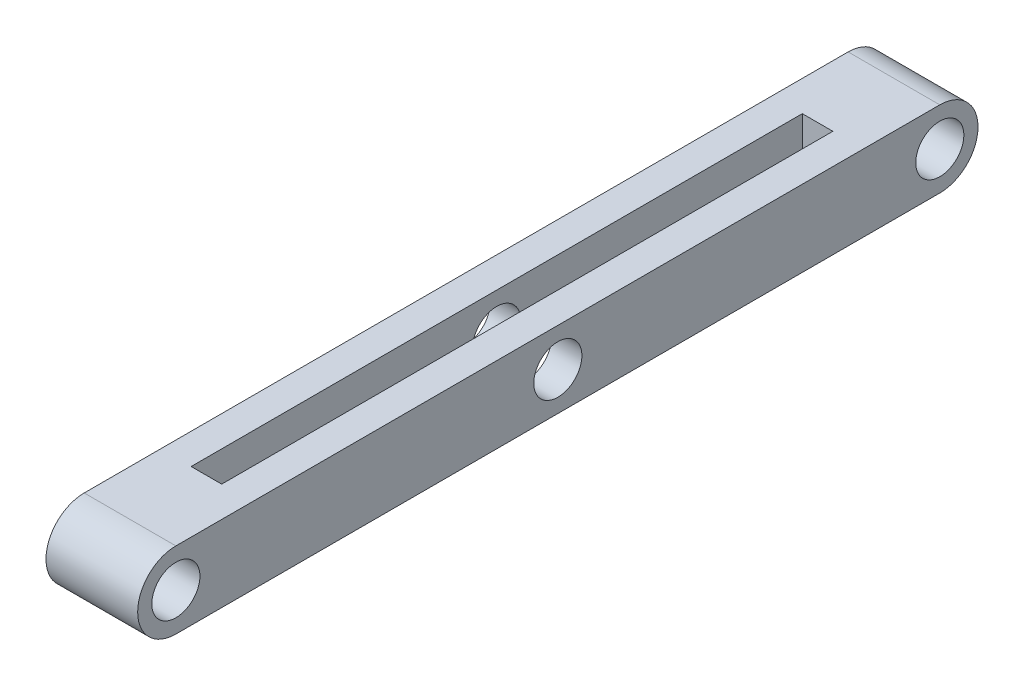
ISO-10303-21;
HEADER;
FILE_DESCRIPTION(('STEP AP214'),'2;1');
FILE_NAME('part.step','',(''),(''),'','','');
FILE_SCHEMA(('AUTOMOTIVE_DESIGN { 1 0 10303 214 1 1 1 1 }'));
ENDSEC;
DATA;
#1=APPLICATION_CONTEXT('core data for automotive mechanical design processes');
#2=APPLICATION_PROTOCOL_DEFINITION('international standard','automotive_design',2000,#1);
#3=PRODUCT_CONTEXT('',#1,'mechanical');
#4=PRODUCT('Part','Part','',(#3));
#5=PRODUCT_RELATED_PRODUCT_CATEGORY('part','',(#4));
#6=PRODUCT_DEFINITION_FORMATION('','',#4);
#7=PRODUCT_DEFINITION_CONTEXT('part definition',#1,'design');
#8=PRODUCT_DEFINITION('design','',#6,#7);
#9=PRODUCT_DEFINITION_SHAPE('','',#8);
#10=(LENGTH_UNIT() NAMED_UNIT(*) SI_UNIT(.MILLI.,.METRE.));
#11=(NAMED_UNIT(*) PLANE_ANGLE_UNIT() SI_UNIT($,.RADIAN.));
#12=(NAMED_UNIT(*) SI_UNIT($,.STERADIAN.) SOLID_ANGLE_UNIT());
#13=UNCERTAINTY_MEASURE_WITH_UNIT(LENGTH_MEASURE(1.E-05),#10,'distance_accuracy_value','');
#14=(GEOMETRIC_REPRESENTATION_CONTEXT(3) GLOBAL_UNCERTAINTY_ASSIGNED_CONTEXT((#13)) GLOBAL_UNIT_ASSIGNED_CONTEXT((#10,
#11,#12)) REPRESENTATION_CONTEXT('',''));
#15=CARTESIAN_POINT('',(0.,0.,0.));
#16=DIRECTION('',(0.,0.,1.));
#17=DIRECTION('',(1.,0.,0.));
#18=AXIS2_PLACEMENT_3D('',#15,#16,#17);
#19=CARTESIAN_POINT('',(15.24,2.06374999999999,13.97));
#20=DIRECTION('',(1.,0.,0.));
#21=DIRECTION('',(0.,0.,-1.));
#22=AXIS2_PLACEMENT_3D('',#19,#20,#21);
#23=CYLINDRICAL_SURFACE('',#22,3.99999999999998);
#24=CARTESIAN_POINT('',(5.08,2.06374999999999,13.97));
#25=DIRECTION('',(-1.,0.,0.));
#26=DIRECTION('',(0.,0.,1.));
#27=AXIS2_PLACEMENT_3D('',#24,#25,#26);
#28=CIRCLE('',#27,3.99999999999998);
#29=CARTESIAN_POINT('',(5.08,2.06374999999999,17.97));
#30=VERTEX_POINT('',#29);
#31=EDGE_CURVE('E38',#30,#30,#28,.F.);
#32=ORIENTED_EDGE('',*,*,#31,.T.);
#33=EDGE_LOOP('',(#32));
#34=FACE_BOUND('',#33,.T.);
#35=CARTESIAN_POINT('',(0.,2.06374999999999,13.97));
#36=DIRECTION('',(1.,0.,0.));
#37=DIRECTION('',(0.,0.,-1.));
#38=AXIS2_PLACEMENT_3D('',#35,#36,#37);
#39=CIRCLE('',#38,4.);
#40=CARTESIAN_POINT('',(0.,2.06374999999999,9.96999999999997));
#41=VERTEX_POINT('',#40);
#42=EDGE_CURVE('E154',#41,#41,#39,.T.);
#43=ORIENTED_EDGE('',*,*,#42,.F.);
#44=EDGE_LOOP('',(#43));
#45=FACE_BOUND('',#44,.T.);
#46=ADVANCED_FACE('F34',(#34,#45),#23,.F.);
#47=CARTESIAN_POINT('',(15.24,2.06374999999998,77.47));
#48=DIRECTION('',(-1.,0.,0.));
#49=DIRECTION('',(0.,0.,1.));
#50=AXIS2_PLACEMENT_3D('',#47,#48,#49);
#51=CYLINDRICAL_SURFACE('',#50,6.35);
#52=CARTESIAN_POINT('',(0.,2.06374999999998,77.47));
#53=DIRECTION('',(1.,0.,0.));
#54=DIRECTION('',(0.,0.,1.));
#55=AXIS2_PLACEMENT_3D('',#52,#53,#54);
#56=CIRCLE('',#55,6.35);
#57=CARTESIAN_POINT('',(0.,8.41374999999998,77.47));
#58=VERTEX_POINT('',#57);
#59=CARTESIAN_POINT('',(0.,-4.28625000000001,77.47));
#60=VERTEX_POINT('',#59);
#61=EDGE_CURVE('E157',#58,#60,#56,.T.);
#62=ORIENTED_EDGE('',*,*,#61,.T.);
#63=DIRECTION('',(-1.,0.,0.));
#64=VECTOR('',#63,1.);
#65=CARTESIAN_POINT('',(15.24,-4.28625000000001,77.47));
#66=LINE('',#65,#64);
#67=CARTESIAN_POINT('',(15.24,-4.28625000000001,77.47));
#68=VERTEX_POINT('',#67);
#69=EDGE_CURVE('E11',#68,#60,#66,.T.);
#70=ORIENTED_EDGE('',*,*,#69,.F.);
#71=CARTESIAN_POINT('',(15.24,2.06374999999998,77.47));
#72=DIRECTION('',(1.,0.,0.));
#73=DIRECTION('',(0.,0.,1.));
#74=AXIS2_PLACEMENT_3D('',#71,#72,#73);
#75=CIRCLE('',#74,6.35);
#76=CARTESIAN_POINT('',(15.24,8.41374999999998,77.47));
#77=VERTEX_POINT('',#76);
#78=EDGE_CURVE('E158',#77,#68,#75,.T.);
#79=ORIENTED_EDGE('',*,*,#78,.F.);
#80=DIRECTION('',(-1.,0.,0.));
#81=VECTOR('',#80,1.);
#82=CARTESIAN_POINT('',(15.24,8.41374999999998,77.47));
#83=LINE('',#82,#81);
#84=EDGE_CURVE('E168',#77,#58,#83,.T.);
#85=ORIENTED_EDGE('',*,*,#84,.T.);
#86=EDGE_LOOP('',(#62,#70,#79,#85));
#87=FACE_BOUND('',#86,.T.);
#88=ADVANCED_FACE('F36',(#87),#51,.T.);
#89=CARTESIAN_POINT('',(15.24,-4.28625,-49.53));
#90=DIRECTION('',(0.,1.,0.));
#91=DIRECTION('',(0.,0.,1.));
#92=AXIS2_PLACEMENT_3D('',#89,#90,#91);
#93=PLANE('',#92);
#94=DIRECTION('',(-1.,0.,0.));
#95=VECTOR('',#94,1.);
#96=CARTESIAN_POINT('',(5.07999999999998,-4.28625000000001,-36.83));
#97=LINE('',#96,#95);
#98=CARTESIAN_POINT('',(10.16,-4.28625000000001,-36.83));
#99=VERTEX_POINT('',#98);
#100=CARTESIAN_POINT('',(5.07999999999998,-4.28625000000001,-36.83));
#101=VERTEX_POINT('',#100);
#102=EDGE_CURVE('E110',#99,#101,#97,.T.);
#103=ORIENTED_EDGE('',*,*,#102,.T.);
#104=DIRECTION('',(0.,0.,1.));
#105=VECTOR('',#104,1.);
#106=CARTESIAN_POINT('',(5.08000000000001,-4.28625000000001,64.77));
#107=LINE('',#106,#105);
#108=CARTESIAN_POINT('',(5.08000000000001,-4.28625000000001,64.77));
#109=VERTEX_POINT('',#108);
#110=EDGE_CURVE('E104',#101,#109,#107,.T.);
#111=ORIENTED_EDGE('',*,*,#110,.T.);
#112=DIRECTION('',(1.,0.,0.));
#113=VECTOR('',#112,1.);
#114=CARTESIAN_POINT('',(5.08000000000001,-4.28625000000001,64.77));
#115=LINE('',#114,#113);
#116=CARTESIAN_POINT('',(10.16,-4.28625000000001,64.77));
#117=VERTEX_POINT('',#116);
#118=EDGE_CURVE('E113',#109,#117,#115,.T.);
#119=ORIENTED_EDGE('',*,*,#118,.T.);
#120=DIRECTION('',(0.,0.,-1.));
#121=VECTOR('',#120,1.);
#122=CARTESIAN_POINT('',(10.16,-4.28625000000001,64.77));
#123=LINE('',#122,#121);
#124=EDGE_CURVE('E51',#117,#99,#123,.T.);
#125=ORIENTED_EDGE('',*,*,#124,.T.);
#126=EDGE_LOOP('',(#103,#111,#119,#125));
#127=FACE_BOUND('',#126,.T.);
#128=DIRECTION('',(0.,0.,-1.));
#129=VECTOR('',#128,1.);
#130=CARTESIAN_POINT('',(0.,-4.28625,-49.53));
#131=LINE('',#130,#129);
#132=CARTESIAN_POINT('',(0.,-4.28625,-49.53));
#133=VERTEX_POINT('',#132);
#134=EDGE_CURVE('E171',#60,#133,#131,.T.);
#135=ORIENTED_EDGE('',*,*,#134,.T.);
#136=DIRECTION('',(-1.,0.,0.));
#137=VECTOR('',#136,1.);
#138=CARTESIAN_POINT('',(15.24,-4.28625,-49.53));
#139=LINE('',#138,#137);
#140=CARTESIAN_POINT('',(15.24,-4.28625,-49.53));
#141=VERTEX_POINT('',#140);
#142=EDGE_CURVE('E43',#141,#133,#139,.T.);
#143=ORIENTED_EDGE('',*,*,#142,.F.);
#144=DIRECTION('',(0.,0.,-1.));
#145=VECTOR('',#144,1.);
#146=CARTESIAN_POINT('',(15.24,-4.28625,-49.53));
#147=LINE('',#146,#145);
#148=EDGE_CURVE('E161',#68,#141,#147,.T.);
#149=ORIENTED_EDGE('',*,*,#148,.F.);
#150=ORIENTED_EDGE('',*,*,#69,.T.);
#151=EDGE_LOOP('',(#135,#143,#149,#150));
#152=FACE_BOUND('',#151,.T.);
#153=ADVANCED_FACE('F117',(#127,#152),#93,.F.);
#154=CARTESIAN_POINT('',(15.24,2.06374999999999,-49.53));
#155=DIRECTION('',(-1.,0.,0.));
#156=DIRECTION('',(0.,0.,1.));
#157=AXIS2_PLACEMENT_3D('',#154,#155,#156);
#158=CYLINDRICAL_SURFACE('',#157,6.34999999999999);
#159=CARTESIAN_POINT('',(0.,2.06374999999999,-49.53));
#160=DIRECTION('',(1.,0.,0.));
#161=DIRECTION('',(0.,0.,-1.));
#162=AXIS2_PLACEMENT_3D('',#159,#160,#161);
#163=CIRCLE('',#162,6.34999999999999);
#164=CARTESIAN_POINT('',(0.,8.41374999999998,-49.53));
#165=VERTEX_POINT('',#164);
#166=EDGE_CURVE('E173',#133,#165,#163,.T.);
#167=ORIENTED_EDGE('',*,*,#166,.T.);
#168=DIRECTION('',(-1.,0.,0.));
#169=VECTOR('',#168,1.);
#170=CARTESIAN_POINT('',(15.24,8.41374999999998,-49.53));
#171=LINE('',#170,#169);
#172=CARTESIAN_POINT('',(15.24,8.41374999999998,-49.53));
#173=VERTEX_POINT('',#172);
#174=EDGE_CURVE('E178',#173,#165,#171,.T.);
#175=ORIENTED_EDGE('',*,*,#174,.F.);
#176=CARTESIAN_POINT('',(15.24,2.06374999999999,-49.53));
#177=DIRECTION('',(1.,0.,0.));
#178=DIRECTION('',(0.,0.,-1.));
#179=AXIS2_PLACEMENT_3D('',#176,#177,#178);
#180=CIRCLE('',#179,6.34999999999999);
#181=EDGE_CURVE('E164',#141,#173,#180,.T.);
#182=ORIENTED_EDGE('',*,*,#181,.F.);
#183=ORIENTED_EDGE('',*,*,#142,.T.);
#184=EDGE_LOOP('',(#167,#175,#182,#183));
#185=FACE_BOUND('',#184,.T.);
#186=ADVANCED_FACE('F239',(#185),#158,.T.);
#187=CARTESIAN_POINT('',(15.24,8.41374999999998,77.47));
#188=DIRECTION('',(0.,-1.,0.));
#189=DIRECTION('',(0.,0.,-1.));
#190=AXIS2_PLACEMENT_3D('',#187,#188,#189);
#191=PLANE('',#190);
#192=DIRECTION('',(1.,0.,0.));
#193=VECTOR('',#192,1.);
#194=CARTESIAN_POINT('',(5.08000000000001,8.41374999999998,64.77));
#195=LINE('',#194,#193);
#196=CARTESIAN_POINT('',(5.08000000000001,8.41374999999998,64.77));
#197=VERTEX_POINT('',#196);
#198=CARTESIAN_POINT('',(10.16,8.41374999999998,64.77));
#199=VERTEX_POINT('',#198);
#200=EDGE_CURVE('E129',#197,#199,#195,.T.);
#201=ORIENTED_EDGE('',*,*,#200,.F.);
#202=DIRECTION('',(0.,0.,1.));
#203=VECTOR('',#202,1.);
#204=CARTESIAN_POINT('',(5.08000000000001,8.41374999999998,64.77));
#205=LINE('',#204,#203);
#206=CARTESIAN_POINT('',(5.07999999999998,8.41374999999998,-36.83));
#207=VERTEX_POINT('',#206);
#208=EDGE_CURVE('E59',#207,#197,#205,.T.);
#209=ORIENTED_EDGE('',*,*,#208,.F.);
#210=DIRECTION('',(-1.,0.,0.));
#211=VECTOR('',#210,1.);
#212=CARTESIAN_POINT('',(5.07999999999998,8.41374999999998,-36.83));
#213=LINE('',#212,#211);
#214=CARTESIAN_POINT('',(10.16,8.41374999999998,-36.83));
#215=VERTEX_POINT('',#214);
#216=EDGE_CURVE('E120',#215,#207,#213,.T.);
#217=ORIENTED_EDGE('',*,*,#216,.F.);
#218=DIRECTION('',(0.,0.,-1.));
#219=VECTOR('',#218,1.);
#220=CARTESIAN_POINT('',(10.16,8.41374999999998,64.77));
#221=LINE('',#220,#219);
#222=EDGE_CURVE('E123',#199,#215,#221,.T.);
#223=ORIENTED_EDGE('',*,*,#222,.F.);
#224=EDGE_LOOP('',(#201,#209,#217,#223));
#225=FACE_BOUND('',#224,.T.);
#226=DIRECTION('',(0.,0.,1.));
#227=VECTOR('',#226,1.);
#228=CARTESIAN_POINT('',(0.,8.41374999999998,77.47));
#229=LINE('',#228,#227);
#230=EDGE_CURVE('E162',#165,#58,#229,.T.);
#231=ORIENTED_EDGE('',*,*,#230,.T.);
#232=ORIENTED_EDGE('',*,*,#84,.F.);
#233=DIRECTION('',(0.,0.,1.));
#234=VECTOR('',#233,1.);
#235=CARTESIAN_POINT('',(15.24,8.41374999999998,77.47));
#236=LINE('',#235,#234);
#237=EDGE_CURVE('E166',#173,#77,#236,.T.);
#238=ORIENTED_EDGE('',*,*,#237,.F.);
#239=ORIENTED_EDGE('',*,*,#174,.T.);
#240=EDGE_LOOP('',(#231,#232,#238,#239));
#241=FACE_BOUND('',#240,.T.);
#242=ADVANCED_FACE('F227',(#225,#241),#191,.F.);
#243=CARTESIAN_POINT('',(15.24,2.06374999999998,77.47));
#244=DIRECTION('',(-1.,0.,0.));
#245=DIRECTION('',(0.,0.,1.));
#246=AXIS2_PLACEMENT_3D('',#243,#244,#245);
#247=PLANE('',#246);
#248=CARTESIAN_POINT('',(15.24,2.06374999999998,77.47));
#249=DIRECTION('',(1.,0.,0.));
#250=DIRECTION('',(0.,0.,-1.));
#251=AXIS2_PLACEMENT_3D('',#248,#249,#250);
#252=CIRCLE('',#251,3.99999999999997);
#253=CARTESIAN_POINT('',(15.24,2.06374999999998,73.47));
#254=VERTEX_POINT('',#253);
#255=EDGE_CURVE('E139',#254,#254,#252,.T.);
#256=ORIENTED_EDGE('',*,*,#255,.F.);
#257=EDGE_LOOP('',(#256));
#258=FACE_BOUND('',#257,.T.);
#259=CARTESIAN_POINT('',(15.24,2.06374999999999,-49.53));
#260=DIRECTION('',(1.,0.,0.));
#261=DIRECTION('',(0.,0.,-1.));
#262=AXIS2_PLACEMENT_3D('',#259,#260,#261);
#263=CIRCLE('',#262,3.99999999999997);
#264=CARTESIAN_POINT('',(15.24,2.06374999999999,-53.53));
#265=VERTEX_POINT('',#264);
#266=EDGE_CURVE('E145',#265,#265,#263,.T.);
#267=ORIENTED_EDGE('',*,*,#266,.F.);
#268=EDGE_LOOP('',(#267));
#269=FACE_BOUND('',#268,.T.);
#270=CARTESIAN_POINT('',(15.24,2.06374999999999,13.97));
#271=DIRECTION('',(1.,0.,0.));
#272=DIRECTION('',(0.,0.,-1.));
#273=AXIS2_PLACEMENT_3D('',#270,#271,#272);
#274=CIRCLE('',#273,3.99999999999997);
#275=CARTESIAN_POINT('',(15.24,2.06374999999999,9.97));
#276=VERTEX_POINT('',#275);
#277=EDGE_CURVE('E151',#276,#276,#274,.T.);
#278=ORIENTED_EDGE('',*,*,#277,.F.);
#279=EDGE_LOOP('',(#278));
#280=FACE_BOUND('',#279,.T.);
#281=ORIENTED_EDGE('',*,*,#78,.T.);
#282=ORIENTED_EDGE('',*,*,#148,.T.);
#283=ORIENTED_EDGE('',*,*,#181,.T.);
#284=ORIENTED_EDGE('',*,*,#237,.T.);
#285=EDGE_LOOP('',(#281,#282,#283,#284));
#286=FACE_BOUND('',#285,.T.);
#287=ADVANCED_FACE('F219',(#258,#269,#280,#286),#247,.F.);
#288=CARTESIAN_POINT('',(0.,2.06374999999998,77.47));
#289=DIRECTION('',(-1.,0.,0.));
#290=DIRECTION('',(0.,0.,1.));
#291=AXIS2_PLACEMENT_3D('',#288,#289,#290);
#292=PLANE('',#291);
#293=CARTESIAN_POINT('',(0.,2.06374999999998,77.47));
#294=DIRECTION('',(1.,0.,0.));
#295=DIRECTION('',(0.,0.,-1.));
#296=AXIS2_PLACEMENT_3D('',#293,#294,#295);
#297=CIRCLE('',#296,4.);
#298=CARTESIAN_POINT('',(0.,2.06374999999998,73.47));
#299=VERTEX_POINT('',#298);
#300=EDGE_CURVE('E142',#299,#299,#297,.T.);
#301=ORIENTED_EDGE('',*,*,#300,.T.);
#302=EDGE_LOOP('',(#301));
#303=FACE_BOUND('',#302,.T.);
#304=CARTESIAN_POINT('',(0.,2.06374999999999,-49.53));
#305=DIRECTION('',(1.,0.,0.));
#306=DIRECTION('',(0.,0.,-1.));
#307=AXIS2_PLACEMENT_3D('',#304,#305,#306);
#308=CIRCLE('',#307,4.);
#309=CARTESIAN_POINT('',(0.,2.06374999999999,-53.53));
#310=VERTEX_POINT('',#309);
#311=EDGE_CURVE('E148',#310,#310,#308,.T.);
#312=ORIENTED_EDGE('',*,*,#311,.T.);
#313=EDGE_LOOP('',(#312));
#314=FACE_BOUND('',#313,.T.);
#315=ORIENTED_EDGE('',*,*,#42,.T.);
#316=EDGE_LOOP('',(#315));
#317=FACE_BOUND('',#316,.T.);
#318=ORIENTED_EDGE('',*,*,#61,.F.);
#319=ORIENTED_EDGE('',*,*,#230,.F.);
#320=ORIENTED_EDGE('',*,*,#166,.F.);
#321=ORIENTED_EDGE('',*,*,#134,.F.);
#322=EDGE_LOOP('',(#318,#319,#320,#321));
#323=FACE_BOUND('',#322,.T.);
#324=ADVANCED_FACE('F213',(#303,#314,#317,#323),#292,.T.);
#325=CARTESIAN_POINT('',(10.16,2.06374999999999,13.97));
#326=DIRECTION('',(1.,0.,0.));
#327=DIRECTION('',(0.,0.,-1.));
#328=AXIS2_PLACEMENT_3D('',#325,#326,#327);
#329=CIRCLE('',#328,3.99999999999998);
#330=CARTESIAN_POINT('',(10.16,2.06374999999999,9.96999999999999));
#331=VERTEX_POINT('',#330);
#332=EDGE_CURVE('E135',#331,#331,#329,.F.);
#333=ORIENTED_EDGE('',*,*,#332,.T.);
#334=EDGE_LOOP('',(#333));
#335=FACE_BOUND('',#334,.T.);
#336=ORIENTED_EDGE('',*,*,#277,.T.);
#337=EDGE_LOOP('',(#336));
#338=FACE_BOUND('',#337,.T.);
#339=ADVANCED_FACE('F205',(#335,#338),#23,.F.);
#340=CARTESIAN_POINT('',(15.24,2.06374999999999,-49.53));
#341=DIRECTION('',(1.,0.,0.));
#342=DIRECTION('',(0.,0.,-1.));
#343=AXIS2_PLACEMENT_3D('',#340,#341,#342);
#344=CYLINDRICAL_SURFACE('',#343,3.99999999999998);
#345=ORIENTED_EDGE('',*,*,#311,.F.);
#346=EDGE_LOOP('',(#345));
#347=FACE_BOUND('',#346,.T.);
#348=ORIENTED_EDGE('',*,*,#266,.T.);
#349=EDGE_LOOP('',(#348));
#350=FACE_BOUND('',#349,.T.);
#351=ADVANCED_FACE('F199',(#347,#350),#344,.F.);
#352=CARTESIAN_POINT('',(15.24,2.06374999999998,77.47));
#353=DIRECTION('',(1.,0.,0.));
#354=DIRECTION('',(0.,0.,-1.));
#355=AXIS2_PLACEMENT_3D('',#352,#353,#354);
#356=CYLINDRICAL_SURFACE('',#355,3.99999999999998);
#357=ORIENTED_EDGE('',*,*,#300,.F.);
#358=EDGE_LOOP('',(#357));
#359=FACE_BOUND('',#358,.T.);
#360=ORIENTED_EDGE('',*,*,#255,.T.);
#361=EDGE_LOOP('',(#360));
#362=FACE_BOUND('',#361,.T.);
#363=ADVANCED_FACE('F191',(#359,#362),#356,.F.);
#364=CARTESIAN_POINT('',(5.08000000000001,-4.28625000000001,64.77));
#365=DIRECTION('',(-1.,0.,0.));
#366=DIRECTION('',(0.,0.,1.));
#367=AXIS2_PLACEMENT_3D('',#364,#365,#366);
#368=PLANE('',#367);
#369=ORIENTED_EDGE('',*,*,#208,.T.);
#370=DIRECTION('',(0.,1.,0.));
#371=VECTOR('',#370,1.);
#372=CARTESIAN_POINT('',(5.08000000000001,-4.28625000000001,64.77));
#373=LINE('',#372,#371);
#374=EDGE_CURVE('E99',#109,#197,#373,.T.);
#375=ORIENTED_EDGE('',*,*,#374,.F.);
#376=ORIENTED_EDGE('',*,*,#110,.F.);
#377=DIRECTION('',(0.,1.,0.));
#378=VECTOR('',#377,1.);
#379=CARTESIAN_POINT('',(5.07999999999998,-4.28625000000001,-36.83));
#380=LINE('',#379,#378);
#381=EDGE_CURVE('E133',#101,#207,#380,.T.);
#382=ORIENTED_EDGE('',*,*,#381,.T.);
#383=EDGE_LOOP('',(#369,#375,#376,#382));
#384=FACE_BOUND('',#383,.T.);
#385=ORIENTED_EDGE('',*,*,#31,.F.);
#386=EDGE_LOOP('',(#385));
#387=FACE_BOUND('',#386,.T.);
#388=ADVANCED_FACE('F101',(#384,#387),#368,.F.);
#389=CARTESIAN_POINT('',(10.16,-4.28625000000001,64.77));
#390=DIRECTION('',(1.,0.,0.));
#391=DIRECTION('',(0.,0.,-1.));
#392=AXIS2_PLACEMENT_3D('',#389,#390,#391);
#393=PLANE('',#392);
#394=ORIENTED_EDGE('',*,*,#222,.T.);
#395=DIRECTION('',(0.,1.,0.));
#396=VECTOR('',#395,1.);
#397=CARTESIAN_POINT('',(10.16,-4.28625000000001,-36.83));
#398=LINE('',#397,#396);
#399=EDGE_CURVE('E136',#99,#215,#398,.T.);
#400=ORIENTED_EDGE('',*,*,#399,.F.);
#401=ORIENTED_EDGE('',*,*,#124,.F.);
#402=DIRECTION('',(0.,1.,0.));
#403=VECTOR('',#402,1.);
#404=CARTESIAN_POINT('',(10.16,-4.28625000000001,64.77));
#405=LINE('',#404,#403);
#406=EDGE_CURVE('E109',#117,#199,#405,.T.);
#407=ORIENTED_EDGE('',*,*,#406,.T.);
#408=EDGE_LOOP('',(#394,#400,#401,#407));
#409=FACE_BOUND('',#408,.T.);
#410=ORIENTED_EDGE('',*,*,#332,.F.);
#411=EDGE_LOOP('',(#410));
#412=FACE_BOUND('',#411,.T.);
#413=ADVANCED_FACE('F190',(#409,#412),#393,.F.);
#414=CARTESIAN_POINT('',(5.07999999999998,-4.28625000000001,-36.83));
#415=DIRECTION('',(0.,0.,-1.));
#416=DIRECTION('',(-1.,0.,0.));
#417=AXIS2_PLACEMENT_3D('',#414,#415,#416);
#418=PLANE('',#417);
#419=ORIENTED_EDGE('',*,*,#216,.T.);
#420=ORIENTED_EDGE('',*,*,#381,.F.);
#421=ORIENTED_EDGE('',*,*,#102,.F.);
#422=ORIENTED_EDGE('',*,*,#399,.T.);
#423=EDGE_LOOP('',(#419,#420,#421,#422));
#424=FACE_BOUND('',#423,.T.);
#425=ADVANCED_FACE('F197',(#424),#418,.F.);
#426=CARTESIAN_POINT('',(5.08000000000001,-4.28625000000001,64.77));
#427=DIRECTION('',(0.,0.,1.));
#428=DIRECTION('',(1.,0.,0.));
#429=AXIS2_PLACEMENT_3D('',#426,#427,#428);
#430=PLANE('',#429);
#431=ORIENTED_EDGE('',*,*,#200,.T.);
#432=ORIENTED_EDGE('',*,*,#406,.F.);
#433=ORIENTED_EDGE('',*,*,#118,.F.);
#434=ORIENTED_EDGE('',*,*,#374,.T.);
#435=EDGE_LOOP('',(#431,#432,#433,#434));
#436=FACE_BOUND('',#435,.T.);
#437=ADVANCED_FACE('F114',(#436),#430,.F.);
#438=CLOSED_SHELL('',(#46,#88,#153,#186,#242,#287,#324,#339,#351,#363,#388,#413,#425,#437));
#439=MANIFOLD_SOLID_BREP('B2',#438);
#440=ADVANCED_BREP_SHAPE_REPRESENTATION('',(#18,#439),#14);
#441=SHAPE_DEFINITION_REPRESENTATION(#9,#440);
ENDSEC;
END-ISO-10303-21;
